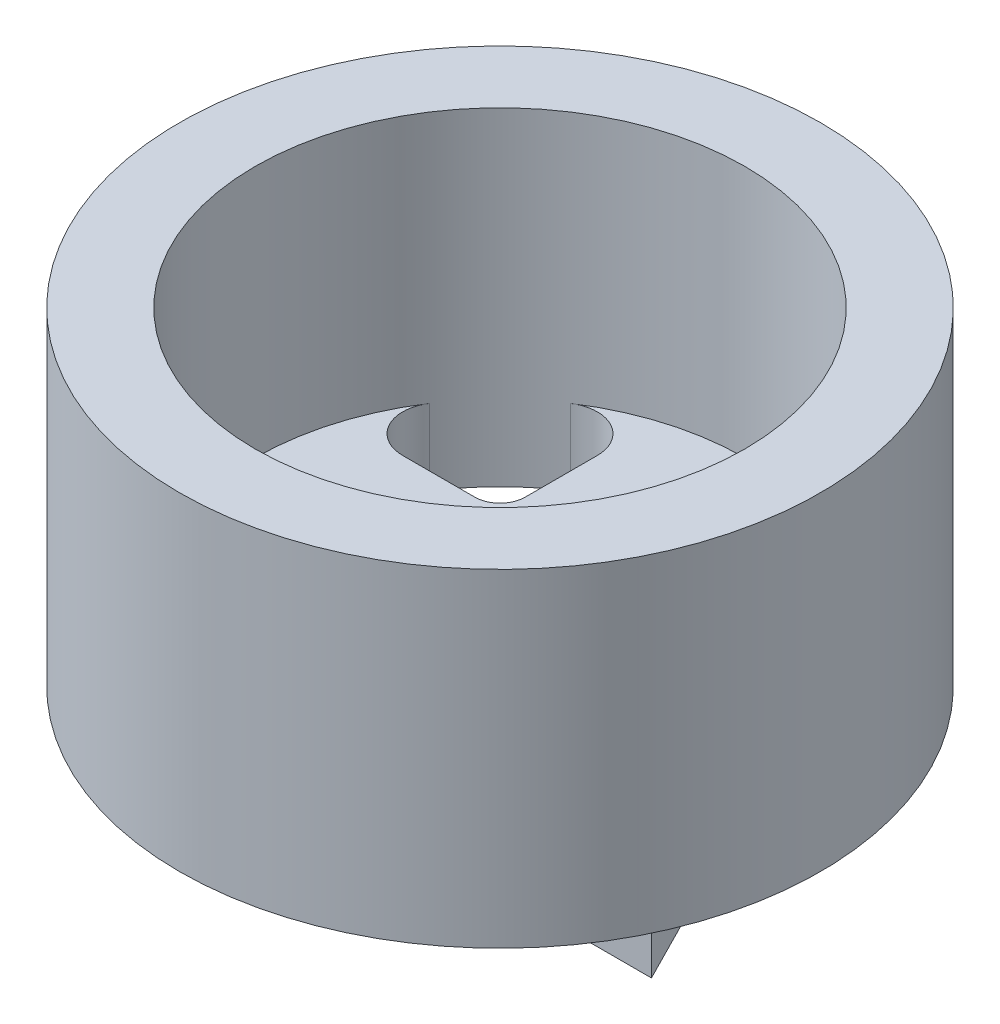
ISO-10303-21;
HEADER;
FILE_DESCRIPTION(('STEP AP214'),'2;1');
FILE_NAME('part.step','',(''),(''),'','','');
FILE_SCHEMA(('AUTOMOTIVE_DESIGN { 1 0 10303 214 1 1 1 1 }'));
ENDSEC;
DATA;
#1=APPLICATION_CONTEXT('core data for automotive mechanical design processes');
#2=APPLICATION_PROTOCOL_DEFINITION('international standard','automotive_design',2000,#1);
#3=PRODUCT_CONTEXT('',#1,'mechanical');
#4=PRODUCT('Part','Part','',(#3));
#5=PRODUCT_RELATED_PRODUCT_CATEGORY('part','',(#4));
#6=PRODUCT_DEFINITION_FORMATION('','',#4);
#7=PRODUCT_DEFINITION_CONTEXT('part definition',#1,'design');
#8=PRODUCT_DEFINITION('design','',#6,#7);
#9=PRODUCT_DEFINITION_SHAPE('','',#8);
#10=(LENGTH_UNIT() NAMED_UNIT(*) SI_UNIT(.MILLI.,.METRE.));
#11=(NAMED_UNIT(*) PLANE_ANGLE_UNIT() SI_UNIT($,.RADIAN.));
#12=(NAMED_UNIT(*) SI_UNIT($,.STERADIAN.) SOLID_ANGLE_UNIT());
#13=UNCERTAINTY_MEASURE_WITH_UNIT(LENGTH_MEASURE(1.E-05),#10,'distance_accuracy_value','');
#14=(GEOMETRIC_REPRESENTATION_CONTEXT(3) GLOBAL_UNCERTAINTY_ASSIGNED_CONTEXT((#13)) GLOBAL_UNIT_ASSIGNED_CONTEXT((#10,
#11,#12)) REPRESENTATION_CONTEXT('',''));
#15=CARTESIAN_POINT('',(0.,0.,0.));
#16=DIRECTION('',(0.,0.,1.));
#17=DIRECTION('',(1.,0.,0.));
#18=AXIS2_PLACEMENT_3D('',#15,#16,#17);
#19=CARTESIAN_POINT('',(-3.,0.,0.));
#20=DIRECTION('',(0.,-1.,0.));
#21=DIRECTION('',(0.,0.,-1.));
#22=AXIS2_PLACEMENT_3D('',#19,#20,#21);
#23=PLANE('',#22);
#24=DIRECTION('',(1.,0.,0.));
#25=VECTOR('',#24,1.);
#26=CARTESIAN_POINT('',(-3.,0.,-3.));
#27=LINE('',#26,#25);
#28=CARTESIAN_POINT('',(-3.,0.,-3.));
#29=VERTEX_POINT('',#28);
#30=CARTESIAN_POINT('',(3.,0.,-3.));
#31=VERTEX_POINT('',#30);
#32=EDGE_CURVE('E52',#29,#31,#27,.T.);
#33=ORIENTED_EDGE('',*,*,#32,.T.);
#34=DIRECTION('',(0.,0.,-1.));
#35=VECTOR('',#34,1.);
#36=CARTESIAN_POINT('',(3.,0.,0.));
#37=LINE('',#36,#35);
#38=CARTESIAN_POINT('',(3.,0.,-12.7));
#39=VERTEX_POINT('',#38);
#40=EDGE_CURVE('E85',#31,#39,#37,.T.);
#41=ORIENTED_EDGE('',*,*,#40,.T.);
#42=DIRECTION('',(1.,0.,0.));
#43=VECTOR('',#42,1.);
#44=CARTESIAN_POINT('',(-3.,0.,-12.7));
#45=LINE('',#44,#43);
#46=CARTESIAN_POINT('',(-3.,0.,-12.7));
#47=VERTEX_POINT('',#46);
#48=EDGE_CURVE('E12',#47,#39,#45,.T.);
#49=ORIENTED_EDGE('',*,*,#48,.F.);
#50=DIRECTION('',(0.,0.,-1.));
#51=VECTOR('',#50,1.);
#52=CARTESIAN_POINT('',(-3.,0.,0.));
#53=LINE('',#52,#51);
#54=EDGE_CURVE('E87',#29,#47,#53,.T.);
#55=ORIENTED_EDGE('',*,*,#54,.F.);
#56=EDGE_LOOP('',(#33,#41,#49,#55));
#57=FACE_BOUND('',#56,.T.);
#58=ADVANCED_FACE('F49',(#57),#23,.F.);
#59=CARTESIAN_POINT('',(-3.,-6.34705548972126,-6.54335617497038));
#60=DIRECTION('',(0.,0.696257929457928,0.717791679853535));
#61=DIRECTION('',(0.,-0.717791679853535,0.696257929457928));
#62=AXIS2_PLACEMENT_3D('',#59,#60,#61);
#63=PLANE('',#62);
#64=ORIENTED_EDGE('',*,*,#48,.T.);
#65=DIRECTION('',(0.,-0.717791679853535,0.696257929457928));
#66=VECTOR('',#65,1.);
#67=CARTESIAN_POINT('',(3.,-6.34705548972126,-6.54335617497038));
#68=LINE('',#67,#66);
#69=CARTESIAN_POINT('',(3.,-10.,-3.));
#70=VERTEX_POINT('',#69);
#71=EDGE_CURVE('E95',#39,#70,#68,.T.);
#72=ORIENTED_EDGE('',*,*,#71,.T.);
#73=DIRECTION('',(1.,0.,0.));
#74=VECTOR('',#73,1.);
#75=CARTESIAN_POINT('',(-3.,-10.,-3.));
#76=LINE('',#75,#74);
#77=CARTESIAN_POINT('',(-3.,-10.,-3.));
#78=VERTEX_POINT('',#77);
#79=EDGE_CURVE('E57',#78,#70,#76,.T.);
#80=ORIENTED_EDGE('',*,*,#79,.F.);
#81=DIRECTION('',(0.,-0.717791679853535,0.696257929457928));
#82=VECTOR('',#81,1.);
#83=CARTESIAN_POINT('',(-3.,-6.34705548972126,-6.54335617497038));
#84=LINE('',#83,#82);
#85=EDGE_CURVE('E64',#47,#78,#84,.T.);
#86=ORIENTED_EDGE('',*,*,#85,.F.);
#87=EDGE_LOOP('',(#64,#72,#80,#86));
#88=FACE_BOUND('',#87,.T.);
#89=ADVANCED_FACE('F105',(#88),#63,.F.);
#90=CARTESIAN_POINT('',(-3.,0.,-3.));
#91=DIRECTION('',(0.,0.,1.));
#92=DIRECTION('',(0.,-1.,0.));
#93=AXIS2_PLACEMENT_3D('',#90,#91,#92);
#94=PLANE('',#93);
#95=ORIENTED_EDGE('',*,*,#79,.T.);
#96=DIRECTION('',(0.,-1.,0.));
#97=VECTOR('',#96,1.);
#98=CARTESIAN_POINT('',(3.,0.,-3.));
#99=LINE('',#98,#97);
#100=EDGE_CURVE('E91',#31,#70,#99,.T.);
#101=ORIENTED_EDGE('',*,*,#100,.F.);
#102=ORIENTED_EDGE('',*,*,#32,.F.);
#103=DIRECTION('',(0.,-1.,0.));
#104=VECTOR('',#103,1.);
#105=CARTESIAN_POINT('',(-3.,0.,-3.));
#106=LINE('',#105,#104);
#107=EDGE_CURVE('E102',#29,#78,#106,.T.);
#108=ORIENTED_EDGE('',*,*,#107,.T.);
#109=EDGE_LOOP('',(#95,#101,#102,#108));
#110=FACE_BOUND('',#109,.T.);
#111=ADVANCED_FACE('F92',(#110),#94,.T.);
#112=CARTESIAN_POINT('',(-3.,0.,0.));
#113=DIRECTION('',(1.,0.,0.));
#114=DIRECTION('',(0.,0.,-1.));
#115=AXIS2_PLACEMENT_3D('',#112,#113,#114);
#116=PLANE('',#115);
#117=ORIENTED_EDGE('',*,*,#54,.T.);
#118=ORIENTED_EDGE('',*,*,#85,.T.);
#119=ORIENTED_EDGE('',*,*,#107,.F.);
#120=EDGE_LOOP('',(#117,#118,#119));
#121=FACE_BOUND('',#120,.T.);
#122=ADVANCED_FACE('F104',(#121),#116,.F.);
#123=CARTESIAN_POINT('',(3.,0.,0.));
#124=DIRECTION('',(1.,0.,0.));
#125=DIRECTION('',(0.,0.,-1.));
#126=AXIS2_PLACEMENT_3D('',#123,#124,#125);
#127=PLANE('',#126);
#128=ORIENTED_EDGE('',*,*,#40,.F.);
#129=ORIENTED_EDGE('',*,*,#100,.T.);
#130=ORIENTED_EDGE('',*,*,#71,.F.);
#131=EDGE_LOOP('',(#128,#129,#130));
#132=FACE_BOUND('',#131,.T.);
#133=ADVANCED_FACE('F97',(#132),#127,.T.);
#134=CLOSED_SHELL('',(#58,#89,#111,#122,#133));
#135=MANIFOLD_SOLID_BREP('B2',#134);
#136=CARTESIAN_POINT('',(0.,13.,0.));
#137=DIRECTION('',(0.,-1.,0.));
#138=DIRECTION('',(0.,0.,-1.));
#139=AXIS2_PLACEMENT_3D('',#136,#137,#138);
#140=CYLINDRICAL_SURFACE('',#139,9.7);
#141=CARTESIAN_POINT('',(0.,3.,0.));
#142=DIRECTION('',(0.,-1.,0.));
#143=DIRECTION('',(0.,0.,-1.));
#144=AXIS2_PLACEMENT_3D('',#141,#142,#143);
#145=CIRCLE('',#144,9.7);
#146=CARTESIAN_POINT('',(-5.32317073170732,3.,-8.10887497505631));
#147=VERTEX_POINT('',#146);
#148=CARTESIAN_POINT('',(5.32317073170732,3.,-8.10887497505631));
#149=VERTEX_POINT('',#148);
#150=EDGE_CURVE('E350',#147,#149,#145,.T.);
#151=ORIENTED_EDGE('',*,*,#150,.T.);
#152=DIRECTION('',(0.,-1.,0.));
#153=VECTOR('',#152,1.);
#154=CARTESIAN_POINT('',(5.32317073170732,13.,-8.10887497505631));
#155=LINE('',#154,#153);
#156=CARTESIAN_POINT('',(5.32317073170732,0.,-8.10887497505631));
#157=VERTEX_POINT('',#156);
#158=EDGE_CURVE('E366',#149,#157,#155,.T.);
#159=ORIENTED_EDGE('',*,*,#158,.T.);
#160=CARTESIAN_POINT('',(0.,0.,0.));
#161=DIRECTION('',(0.,1.,0.));
#162=DIRECTION('',(0.,0.,1.));
#163=AXIS2_PLACEMENT_3D('',#160,#161,#162);
#164=CIRCLE('',#163,9.7);
#165=CARTESIAN_POINT('',(8.10887497505631,0.,-5.32317073170732));
#166=VERTEX_POINT('',#165);
#167=EDGE_CURVE('E511',#166,#157,#164,.T.);
#168=ORIENTED_EDGE('',*,*,#167,.F.);
#169=DIRECTION('',(0.,-1.,0.));
#170=VECTOR('',#169,1.);
#171=CARTESIAN_POINT('',(8.10887497505631,13.,-5.32317073170732));
#172=LINE('',#171,#170);
#173=CARTESIAN_POINT('',(8.10887497505631,3.,-5.32317073170732));
#174=VERTEX_POINT('',#173);
#175=EDGE_CURVE('E360',#166,#174,#172,.F.);
#176=ORIENTED_EDGE('',*,*,#175,.T.);
#177=CARTESIAN_POINT('',(8.10887497505631,3.,5.32317073170732));
#178=VERTEX_POINT('',#177);
#179=EDGE_CURVE('E344',#174,#178,#145,.T.);
#180=ORIENTED_EDGE('',*,*,#179,.T.);
#181=DIRECTION('',(0.,-1.,0.));
#182=VECTOR('',#181,1.);
#183=CARTESIAN_POINT('',(8.10887497505631,13.,5.32317073170732));
#184=LINE('',#183,#182);
#185=CARTESIAN_POINT('',(8.10887497505631,0.,5.32317073170732));
#186=VERTEX_POINT('',#185);
#187=EDGE_CURVE('E357',#178,#186,#184,.T.);
#188=ORIENTED_EDGE('',*,*,#187,.T.);
#189=CARTESIAN_POINT('',(5.32317073170732,0.,8.10887497505631));
#190=VERTEX_POINT('',#189);
#191=EDGE_CURVE('E340',#190,#186,#164,.T.);
#192=ORIENTED_EDGE('',*,*,#191,.F.);
#193=DIRECTION('',(0.,-1.,0.));
#194=VECTOR('',#193,1.);
#195=CARTESIAN_POINT('',(5.32317073170732,13.,8.10887497505631));
#196=LINE('',#195,#194);
#197=CARTESIAN_POINT('',(5.32317073170732,3.,8.10887497505631));
#198=VERTEX_POINT('',#197);
#199=EDGE_CURVE('E354',#190,#198,#196,.F.);
#200=ORIENTED_EDGE('',*,*,#199,.T.);
#201=CARTESIAN_POINT('',(-5.32317073170732,3.,8.10887497505631));
#202=VERTEX_POINT('',#201);
#203=EDGE_CURVE('E348',#198,#202,#145,.T.);
#204=ORIENTED_EDGE('',*,*,#203,.T.);
#205=DIRECTION('',(0.,-1.,0.));
#206=VECTOR('',#205,1.);
#207=CARTESIAN_POINT('',(-5.32317073170732,13.,8.10887497505631));
#208=LINE('',#207,#206);
#209=CARTESIAN_POINT('',(-5.32317073170732,0.,8.10887497505631));
#210=VERTEX_POINT('',#209);
#211=EDGE_CURVE('E336',#202,#210,#208,.T.);
#212=ORIENTED_EDGE('',*,*,#211,.T.);
#213=CARTESIAN_POINT('',(-8.10887497505631,0.,5.32317073170732));
#214=VERTEX_POINT('',#213);
#215=EDGE_CURVE('E320',#214,#210,#164,.T.);
#216=ORIENTED_EDGE('',*,*,#215,.F.);
#217=DIRECTION('',(0.,-1.,0.));
#218=VECTOR('',#217,1.);
#219=CARTESIAN_POINT('',(-8.10887497505631,13.,5.32317073170732));
#220=LINE('',#219,#218);
#221=CARTESIAN_POINT('',(-8.10887497505631,3.,5.32317073170732));
#222=VERTEX_POINT('',#221);
#223=EDGE_CURVE('E333',#214,#222,#220,.F.);
#224=ORIENTED_EDGE('',*,*,#223,.T.);
#225=CARTESIAN_POINT('',(-8.10887497505631,3.,-5.32317073170732));
#226=VERTEX_POINT('',#225);
#227=EDGE_CURVE('E624',#222,#226,#145,.T.);
#228=ORIENTED_EDGE('',*,*,#227,.T.);
#229=DIRECTION('',(0.,-1.,0.));
#230=VECTOR('',#229,1.);
#231=CARTESIAN_POINT('',(-8.10887497505631,13.,-5.32317073170732));
#232=LINE('',#231,#230);
#233=CARTESIAN_POINT('',(-8.10887497505631,0.,-5.32317073170732));
#234=VERTEX_POINT('',#233);
#235=EDGE_CURVE('E343',#226,#234,#232,.T.);
#236=ORIENTED_EDGE('',*,*,#235,.T.);
#237=CARTESIAN_POINT('',(-5.32317073170732,0.,-8.10887497505631));
#238=VERTEX_POINT('',#237);
#239=EDGE_CURVE('E337',#238,#234,#164,.T.);
#240=ORIENTED_EDGE('',*,*,#239,.F.);
#241=DIRECTION('',(0.,-1.,0.));
#242=VECTOR('',#241,1.);
#243=CARTESIAN_POINT('',(-5.32317073170732,13.,-8.10887497505631));
#244=LINE('',#243,#242);
#245=EDGE_CURVE('E363',#238,#147,#244,.F.);
#246=ORIENTED_EDGE('',*,*,#245,.T.);
#247=EDGE_LOOP('',(#151,#159,#168,#176,#180,#188,#192,#200,#204,#212,#216,#224,#228,#236,#240,#246));
#248=FACE_BOUND('',#247,.T.);
#249=CARTESIAN_POINT('',(0.,13.,0.));
#250=DIRECTION('',(0.,1.,0.));
#251=DIRECTION('',(0.,0.,1.));
#252=AXIS2_PLACEMENT_3D('',#249,#250,#251);
#253=CIRCLE('',#252,9.7);
#254=CARTESIAN_POINT('',(0.,13.,9.7));
#255=VERTEX_POINT('',#254);
#256=EDGE_CURVE('E504',#255,#255,#253,.T.);
#257=ORIENTED_EDGE('',*,*,#256,.T.);
#258=EDGE_LOOP('',(#257));
#259=FACE_BOUND('',#258,.T.);
#260=ADVANCED_FACE('F157',(#248,#259),#140,.F.);
#261=CARTESIAN_POINT('',(0.,13.,0.));
#262=DIRECTION('',(0.,-1.,0.));
#263=DIRECTION('',(0.,0.,-1.));
#264=AXIS2_PLACEMENT_3D('',#261,#262,#263);
#265=CYLINDRICAL_SURFACE('',#264,12.7);
#266=CARTESIAN_POINT('',(0.,13.,0.));
#267=DIRECTION('',(0.,1.,0.));
#268=DIRECTION('',(0.,0.,1.));
#269=AXIS2_PLACEMENT_3D('',#266,#267,#268);
#270=CIRCLE('',#269,12.7);
#271=CARTESIAN_POINT('',(0.,13.,-12.7));
#272=VERTEX_POINT('',#271);
#273=EDGE_CURVE('E507',#272,#272,#270,.T.);
#274=CARTESIAN_POINT('',(0.,0.,0.));
#275=DIRECTION('',(0.,1.,0.));
#276=DIRECTION('',(0.,0.,1.));
#277=AXIS2_PLACEMENT_3D('',#274,#275,#276);
#278=CIRCLE('',#277,12.7);
#279=CARTESIAN_POINT('',(0.,0.,-12.7));
#280=VERTEX_POINT('',#279);
#281=EDGE_CURVE('E508',#280,#280,#278,.T.);
#282=CARTESIAN_POINT('',(0.,13.,-12.7));
#283=CARTESIAN_POINT('',(0.,12.8645833333333,-12.7));
#284=CARTESIAN_POINT('',(0.,12.7291666666667,-12.7));
#285=CARTESIAN_POINT('',(0.,12.4583333333333,-12.7));
#286=CARTESIAN_POINT('',(0.,12.3229166666667,-12.7));
#287=CARTESIAN_POINT('',(0.,12.0520833333333,-12.7));
#288=CARTESIAN_POINT('',(0.,11.9166666666667,-12.7));
#289=CARTESIAN_POINT('',(0.,11.6458333333333,-12.7));
#290=CARTESIAN_POINT('',(0.,11.5104166666667,-12.7));
#291=CARTESIAN_POINT('',(0.,11.2395833333333,-12.7));
#292=CARTESIAN_POINT('',(0.,11.1041666666667,-12.7));
#293=CARTESIAN_POINT('',(0.,10.8333333333333,-12.7));
#294=CARTESIAN_POINT('',(0.,10.6979166666667,-12.7));
#295=CARTESIAN_POINT('',(0.,10.4270833333333,-12.7));
#296=CARTESIAN_POINT('',(0.,10.2916666666667,-12.7));
#297=CARTESIAN_POINT('',(0.,10.0208333333333,-12.7));
#298=CARTESIAN_POINT('',(0.,9.88541666666667,-12.7));
#299=CARTESIAN_POINT('',(0.,9.61458333333333,-12.7));
#300=CARTESIAN_POINT('',(0.,9.47916666666667,-12.7));
#301=CARTESIAN_POINT('',(0.,9.20833333333333,-12.7));
#302=CARTESIAN_POINT('',(0.,9.07291666666667,-12.7));
#303=CARTESIAN_POINT('',(0.,8.80208333333333,-12.7));
#304=CARTESIAN_POINT('',(0.,8.66666666666667,-12.7));
#305=CARTESIAN_POINT('',(0.,8.39583333333333,-12.7));
#306=CARTESIAN_POINT('',(0.,8.26041666666667,-12.7));
#307=CARTESIAN_POINT('',(0.,7.98958333333333,-12.7));
#308=CARTESIAN_POINT('',(0.,7.85416666666667,-12.7));
#309=CARTESIAN_POINT('',(0.,7.58333333333333,-12.7));
#310=CARTESIAN_POINT('',(0.,7.44791666666667,-12.7));
#311=CARTESIAN_POINT('',(0.,7.17708333333333,-12.7));
#312=CARTESIAN_POINT('',(0.,7.04166666666667,-12.7));
#313=CARTESIAN_POINT('',(0.,6.77083333333333,-12.7));
#314=CARTESIAN_POINT('',(0.,6.63541666666667,-12.7));
#315=CARTESIAN_POINT('',(0.,6.36458333333333,-12.7));
#316=CARTESIAN_POINT('',(0.,6.22916666666667,-12.7));
#317=CARTESIAN_POINT('',(0.,5.95833333333333,-12.7));
#318=CARTESIAN_POINT('',(0.,5.82291666666667,-12.7));
#319=CARTESIAN_POINT('',(0.,5.55208333333333,-12.7));
#320=CARTESIAN_POINT('',(0.,5.41666666666667,-12.7));
#321=CARTESIAN_POINT('',(0.,5.14583333333333,-12.7));
#322=CARTESIAN_POINT('',(0.,5.01041666666667,-12.7));
#323=CARTESIAN_POINT('',(0.,4.73958333333333,-12.7));
#324=CARTESIAN_POINT('',(0.,4.60416666666667,-12.7));
#325=CARTESIAN_POINT('',(0.,4.33333333333333,-12.7));
#326=CARTESIAN_POINT('',(0.,4.19791666666667,-12.7));
#327=CARTESIAN_POINT('',(0.,3.92708333333333,-12.7));
#328=CARTESIAN_POINT('',(0.,3.79166666666667,-12.7));
#329=CARTESIAN_POINT('',(0.,3.52083333333333,-12.7));
#330=CARTESIAN_POINT('',(0.,3.38541666666667,-12.7));
#331=CARTESIAN_POINT('',(0.,3.11458333333333,-12.7));
#332=CARTESIAN_POINT('',(0.,2.97916666666667,-12.7));
#333=CARTESIAN_POINT('',(0.,2.70833333333333,-12.7));
#334=CARTESIAN_POINT('',(0.,2.57291666666667,-12.7));
#335=CARTESIAN_POINT('',(0.,2.30208333333333,-12.7));
#336=CARTESIAN_POINT('',(0.,2.16666666666667,-12.7));
#337=CARTESIAN_POINT('',(0.,1.89583333333333,-12.7));
#338=CARTESIAN_POINT('',(0.,1.76041666666667,-12.7));
#339=CARTESIAN_POINT('',(0.,1.48958333333333,-12.7));
#340=CARTESIAN_POINT('',(0.,1.35416666666667,-12.7));
#341=CARTESIAN_POINT('',(0.,1.08333333333333,-12.7));
#342=CARTESIAN_POINT('',(0.,0.947916666666667,-12.7));
#343=CARTESIAN_POINT('',(0.,0.677083333333334,-12.7));
#344=CARTESIAN_POINT('',(0.,0.541666666666667,-12.7));
#345=CARTESIAN_POINT('',(0.,0.270833333333334,-12.7));
#346=CARTESIAN_POINT('',(0.,0.135416666666667,-12.7));
#347=CARTESIAN_POINT('',(0.,0.,-12.7));
#348=B_SPLINE_CURVE_WITH_KNOTS('',3,(#282,#283,#284,#285,#286,#287,#288,#289,#290,#291,#292,
#293,#294,#295,#296,#297,#298,#299,#300,#301,#302,#303,#304,#305,#306,#307,#308,#309,#310,#311,
#312,#313,#314,#315,#316,#317,#318,#319,#320,#321,#322,#323,#324,#325,#326,#327,#328,#329,#330,
#331,#332,#333,#334,#335,#336,#337,#338,#339,#340,#341,#342,#343,#344,#345,#346,#347),
.UNSPECIFIED.,.F.,.F.,(4,2,2,2,2,2,2,2,2,2,2,2,2,2,2,2,2,2,2,2,2,2,2,2,2,2,2,2,2,2,2,2,4),(0.,
0.406249999999999,0.812499999999999,1.21875,1.625,2.03125,2.4375,2.84375,3.25,3.65625,4.0625,
4.46875,4.875,5.28125,5.6875,6.09375,6.5,6.90625,7.3125,7.71875,8.125,8.53125,8.9375,9.34375,
9.75,10.15625,10.5625,10.96875,11.375,11.78125,12.1875,12.59375,13.),.UNSPECIFIED.);
#349=EDGE_CURVE('BSEAM515',#272,#280,#348,.T.);
#350=ORIENTED_EDGE('',*,*,#273,.F.);
#351=ORIENTED_EDGE('',*,*,#281,.T.);
#352=ORIENTED_EDGE('',*,*,#349,.T.);
#353=ORIENTED_EDGE('',*,*,#349,.F.);
#354=EDGE_LOOP('',(#350,#352,#351,#353));
#355=FACE_BOUND('',#354,.T.);
#356=ADVANCED_FACE('F515',(#355),#265,.T.);
#357=CARTESIAN_POINT('',(0.,13.,0.));
#358=DIRECTION('',(0.,1.,0.));
#359=DIRECTION('',(0.,0.,1.));
#360=AXIS2_PLACEMENT_3D('',#357,#358,#359);
#361=PLANE('',#360);
#362=ORIENTED_EDGE('',*,*,#256,.F.);
#363=EDGE_LOOP('',(#362));
#364=FACE_BOUND('',#363,.T.);
#365=ORIENTED_EDGE('',*,*,#273,.T.);
#366=EDGE_LOOP('',(#365));
#367=FACE_BOUND('',#366,.T.);
#368=ADVANCED_FACE('F518',(#364,#367),#361,.T.);
#369=CARTESIAN_POINT('',(0.,0.,0.));
#370=DIRECTION('',(0.,1.,0.));
#371=DIRECTION('',(0.,0.,1.));
#372=AXIS2_PLACEMENT_3D('',#369,#370,#371);
#373=PLANE('',#372);
#374=DIRECTION('',(-1.,0.,0.));
#375=VECTOR('',#374,1.);
#376=CARTESIAN_POINT('',(0.,0.,-3.));
#377=LINE('',#376,#375);
#378=CARTESIAN_POINT('',(6.85492523664554,0.,-3.));
#379=VERTEX_POINT('',#378);
#380=CARTESIAN_POINT('',(4.,0.,-3.));
#381=VERTEX_POINT('',#380);
#382=EDGE_CURVE('E484',#379,#381,#377,.T.);
#383=ORIENTED_EDGE('',*,*,#382,.F.);
#384=CARTESIAN_POINT('',(6.85492523664554,0.,-4.5));
#385=DIRECTION('',(0.,1.,0.));
#386=DIRECTION('',(0.,0.,1.));
#387=AXIS2_PLACEMENT_3D('',#384,#385,#386);
#388=CIRCLE('',#387,1.5);
#389=EDGE_CURVE('E399',#379,#166,#388,.T.);
#390=ORIENTED_EDGE('',*,*,#389,.T.);
#391=ORIENTED_EDGE('',*,*,#167,.T.);
#392=CARTESIAN_POINT('',(4.5,0.,-6.85492523664554));
#393=DIRECTION('',(0.,1.,0.));
#394=DIRECTION('',(0.,0.,1.));
#395=AXIS2_PLACEMENT_3D('',#392,#393,#394);
#396=CIRCLE('',#395,1.5);
#397=CARTESIAN_POINT('',(3.,0.,-6.85492523664554));
#398=VERTEX_POINT('',#397);
#399=EDGE_CURVE('E390',#157,#398,#396,.T.);
#400=ORIENTED_EDGE('',*,*,#399,.T.);
#401=DIRECTION('',(0.,0.,1.));
#402=VECTOR('',#401,1.);
#403=CARTESIAN_POINT('',(3.,0.,0.));
#404=LINE('',#403,#402);
#405=CARTESIAN_POINT('',(3.,0.,-4.));
#406=VERTEX_POINT('',#405);
#407=EDGE_CURVE('E492',#398,#406,#404,.T.);
#408=ORIENTED_EDGE('',*,*,#407,.T.);
#409=CARTESIAN_POINT('',(4.,0.,-4.));
#410=DIRECTION('',(0.,1.,0.));
#411=DIRECTION('',(0.,0.,1.));
#412=AXIS2_PLACEMENT_3D('',#409,#410,#411);
#413=CIRCLE('',#412,1.);
#414=EDGE_CURVE('E447',#406,#381,#413,.T.);
#415=ORIENTED_EDGE('',*,*,#414,.T.);
#416=EDGE_LOOP('',(#383,#390,#391,#400,#408,#415));
#417=FACE_BOUND('',#416,.T.);
#418=DIRECTION('',(-1.,0.,0.));
#419=VECTOR('',#418,1.);
#420=CARTESIAN_POINT('',(0.,0.,3.));
#421=LINE('',#420,#419);
#422=CARTESIAN_POINT('',(6.85492523664554,0.,3.));
#423=VERTEX_POINT('',#422);
#424=CARTESIAN_POINT('',(4.,0.,3.));
#425=VERTEX_POINT('',#424);
#426=EDGE_CURVE('E478',#423,#425,#421,.T.);
#427=ORIENTED_EDGE('',*,*,#426,.T.);
#428=CARTESIAN_POINT('',(4.,0.,4.));
#429=DIRECTION('',(0.,1.,0.));
#430=DIRECTION('',(0.,0.,1.));
#431=AXIS2_PLACEMENT_3D('',#428,#429,#430);
#432=CIRCLE('',#431,1.);
#433=CARTESIAN_POINT('',(3.,0.,4.));
#434=VERTEX_POINT('',#433);
#435=EDGE_CURVE('E451',#425,#434,#432,.T.);
#436=ORIENTED_EDGE('',*,*,#435,.T.);
#437=DIRECTION('',(0.,0.,1.));
#438=VECTOR('',#437,1.);
#439=CARTESIAN_POINT('',(3.,0.,0.));
#440=LINE('',#439,#438);
#441=CARTESIAN_POINT('',(3.,0.,6.85492523664554));
#442=VERTEX_POINT('',#441);
#443=EDGE_CURVE('E476',#434,#442,#440,.T.);
#444=ORIENTED_EDGE('',*,*,#443,.T.);
#445=CARTESIAN_POINT('',(4.5,0.,6.85492523664554));
#446=DIRECTION('',(0.,1.,0.));
#447=DIRECTION('',(0.,0.,1.));
#448=AXIS2_PLACEMENT_3D('',#445,#446,#447);
#449=CIRCLE('',#448,1.5);
#450=EDGE_CURVE('E408',#442,#190,#449,.T.);
#451=ORIENTED_EDGE('',*,*,#450,.T.);
#452=ORIENTED_EDGE('',*,*,#191,.T.);
#453=CARTESIAN_POINT('',(6.85492523664554,0.,4.5));
#454=DIRECTION('',(0.,1.,0.));
#455=DIRECTION('',(0.,0.,1.));
#456=AXIS2_PLACEMENT_3D('',#453,#454,#455);
#457=CIRCLE('',#456,1.5);
#458=EDGE_CURVE('E403',#186,#423,#457,.T.);
#459=ORIENTED_EDGE('',*,*,#458,.T.);
#460=EDGE_LOOP('',(#427,#436,#444,#451,#452,#459));
#461=FACE_BOUND('',#460,.T.);
#462=DIRECTION('',(0.,0.,1.));
#463=VECTOR('',#462,1.);
#464=CARTESIAN_POINT('',(-3.,0.,0.));
#465=LINE('',#464,#463);
#466=CARTESIAN_POINT('',(-3.,0.,4.));
#467=VERTEX_POINT('',#466);
#468=CARTESIAN_POINT('',(-3.,0.,6.85492523664554));
#469=VERTEX_POINT('',#468);
#470=EDGE_CURVE('E495',#467,#469,#465,.T.);
#471=ORIENTED_EDGE('',*,*,#470,.F.);
#472=CARTESIAN_POINT('',(-4.,0.,4.));
#473=DIRECTION('',(0.,1.,0.));
#474=DIRECTION('',(0.,0.,1.));
#475=AXIS2_PLACEMENT_3D('',#472,#473,#474);
#476=CIRCLE('',#475,1.);
#477=CARTESIAN_POINT('',(-4.,0.,3.));
#478=VERTEX_POINT('',#477);
#479=EDGE_CURVE('E165',#467,#478,#476,.T.);
#480=ORIENTED_EDGE('',*,*,#479,.T.);
#481=DIRECTION('',(-1.,0.,0.));
#482=VECTOR('',#481,1.);
#483=CARTESIAN_POINT('',(0.,0.,3.));
#484=LINE('',#483,#482);
#485=CARTESIAN_POINT('',(-6.85492523664554,0.,3.));
#486=VERTEX_POINT('',#485);
#487=EDGE_CURVE('E321',#478,#486,#484,.T.);
#488=ORIENTED_EDGE('',*,*,#487,.T.);
#489=CARTESIAN_POINT('',(-6.85492523664554,0.,4.5));
#490=DIRECTION('',(0.,1.,0.));
#491=DIRECTION('',(0.,0.,1.));
#492=AXIS2_PLACEMENT_3D('',#489,#490,#491);
#493=CIRCLE('',#492,1.5);
#494=EDGE_CURVE('E315',#486,#214,#493,.T.);
#495=ORIENTED_EDGE('',*,*,#494,.T.);
#496=ORIENTED_EDGE('',*,*,#215,.T.);
#497=CARTESIAN_POINT('',(-4.5,0.,6.85492523664554));
#498=DIRECTION('',(0.,1.,0.));
#499=DIRECTION('',(0.,0.,1.));
#500=AXIS2_PLACEMENT_3D('',#497,#498,#499);
#501=CIRCLE('',#500,1.5);
#502=EDGE_CURVE('E413',#210,#469,#501,.T.);
#503=ORIENTED_EDGE('',*,*,#502,.T.);
#504=EDGE_LOOP('',(#471,#480,#488,#495,#496,#503));
#505=FACE_BOUND('',#504,.T.);
#506=ORIENTED_EDGE('',*,*,#281,.F.);
#507=EDGE_LOOP('',(#506));
#508=FACE_BOUND('',#507,.T.);
#509=DIRECTION('',(0.,0.,1.));
#510=VECTOR('',#509,1.);
#511=CARTESIAN_POINT('',(-3.,0.,0.));
#512=LINE('',#511,#510);
#513=CARTESIAN_POINT('',(-3.,0.,-6.85492523664554));
#514=VERTEX_POINT('',#513);
#515=CARTESIAN_POINT('',(-3.,0.,-4.));
#516=VERTEX_POINT('',#515);
#517=EDGE_CURVE('E500',#514,#516,#512,.T.);
#518=ORIENTED_EDGE('',*,*,#517,.F.);
#519=CARTESIAN_POINT('',(-4.5,0.,-6.85492523664554));
#520=DIRECTION('',(0.,1.,0.));
#521=DIRECTION('',(0.,0.,1.));
#522=AXIS2_PLACEMENT_3D('',#519,#520,#521);
#523=CIRCLE('',#522,1.5);
#524=EDGE_CURVE('E395',#514,#238,#523,.T.);
#525=ORIENTED_EDGE('',*,*,#524,.T.);
#526=ORIENTED_EDGE('',*,*,#239,.T.);
#527=CARTESIAN_POINT('',(-6.85492523664554,0.,-4.5));
#528=DIRECTION('',(0.,1.,0.));
#529=DIRECTION('',(0.,0.,1.));
#530=AXIS2_PLACEMENT_3D('',#527,#528,#529);
#531=CIRCLE('',#530,1.5);
#532=CARTESIAN_POINT('',(-6.85492523664554,0.,-3.));
#533=VERTEX_POINT('',#532);
#534=EDGE_CURVE('E418',#234,#533,#531,.T.);
#535=ORIENTED_EDGE('',*,*,#534,.T.);
#536=DIRECTION('',(-1.,0.,0.));
#537=VECTOR('',#536,1.);
#538=CARTESIAN_POINT('',(0.,0.,-3.));
#539=LINE('',#538,#537);
#540=CARTESIAN_POINT('',(-4.,0.,-3.));
#541=VERTEX_POINT('',#540);
#542=EDGE_CURVE('E498',#541,#533,#539,.T.);
#543=ORIENTED_EDGE('',*,*,#542,.F.);
#544=CARTESIAN_POINT('',(-4.,0.,-4.));
#545=DIRECTION('',(0.,1.,0.));
#546=DIRECTION('',(0.,0.,1.));
#547=AXIS2_PLACEMENT_3D('',#544,#545,#546);
#548=CIRCLE('',#547,1.);
#549=EDGE_CURVE('E443',#541,#516,#548,.T.);
#550=ORIENTED_EDGE('',*,*,#549,.T.);
#551=EDGE_LOOP('',(#518,#525,#526,#535,#543,#550));
#552=FACE_BOUND('',#551,.T.);
#553=CARTESIAN_POINT('',(0.,0.,0.));
#554=DIRECTION('',(0.,-1.,0.));
#555=DIRECTION('',(0.,0.,-1.));
#556=AXIS2_PLACEMENT_3D('',#553,#554,#555);
#557=CIRCLE('',#556,3.);
#558=CARTESIAN_POINT('',(0.,0.,-3.));
#559=VERTEX_POINT('',#558);
#560=EDGE_CURVE('E482',#559,#559,#557,.T.);
#561=ORIENTED_EDGE('',*,*,#560,.F.);
#562=EDGE_LOOP('',(#561));
#563=FACE_BOUND('',#562,.T.);
#564=ADVANCED_FACE('F317',(#417,#461,#505,#508,#552,#563),#373,.F.);
#565=CARTESIAN_POINT('',(0.,3.,0.));
#566=DIRECTION('',(0.,-1.,0.));
#567=DIRECTION('',(0.,0.,-1.));
#568=AXIS2_PLACEMENT_3D('',#565,#566,#567);
#569=PLANE('',#568);
#570=CARTESIAN_POINT('',(0.,3.,0.));
#571=DIRECTION('',(0.,-1.,0.));
#572=DIRECTION('',(0.,0.,-1.));
#573=AXIS2_PLACEMENT_3D('',#570,#571,#572);
#574=CIRCLE('',#573,3.);
#575=CARTESIAN_POINT('',(0.,3.,-3.));
#576=VERTEX_POINT('',#575);
#577=EDGE_CURVE('E503',#576,#576,#574,.T.);
#578=ORIENTED_EDGE('',*,*,#577,.T.);
#579=EDGE_LOOP('',(#578));
#580=FACE_BOUND('',#579,.T.);
#581=ORIENTED_EDGE('',*,*,#179,.F.);
#582=CARTESIAN_POINT('',(6.85492523664554,3.,-4.5));
#583=DIRECTION('',(0.,-1.,0.));
#584=DIRECTION('',(0.,0.,-1.));
#585=AXIS2_PLACEMENT_3D('',#582,#583,#584);
#586=CIRCLE('',#585,1.5);
#587=CARTESIAN_POINT('',(6.85492523664554,3.,-3.));
#588=VERTEX_POINT('',#587);
#589=EDGE_CURVE('E401',#174,#588,#586,.T.);
#590=ORIENTED_EDGE('',*,*,#589,.T.);
#591=DIRECTION('',(-1.,0.,0.));
#592=VECTOR('',#591,1.);
#593=CARTESIAN_POINT('',(0.,3.,-3.));
#594=LINE('',#593,#592);
#595=CARTESIAN_POINT('',(4.,3.,-3.));
#596=VERTEX_POINT('',#595);
#597=EDGE_CURVE('E471',#588,#596,#594,.T.);
#598=ORIENTED_EDGE('',*,*,#597,.T.);
#599=CARTESIAN_POINT('',(4.,3.,-4.));
#600=DIRECTION('',(0.,-1.,0.));
#601=DIRECTION('',(0.,0.,-1.));
#602=AXIS2_PLACEMENT_3D('',#599,#600,#601);
#603=CIRCLE('',#602,1.);
#604=CARTESIAN_POINT('',(3.,3.,-4.));
#605=VERTEX_POINT('',#604);
#606=EDGE_CURVE('E449',#596,#605,#603,.T.);
#607=ORIENTED_EDGE('',*,*,#606,.T.);
#608=DIRECTION('',(0.,0.,1.));
#609=VECTOR('',#608,1.);
#610=CARTESIAN_POINT('',(3.,3.,0.));
#611=LINE('',#610,#609);
#612=CARTESIAN_POINT('',(3.,3.,-6.85492523664554));
#613=VERTEX_POINT('',#612);
#614=EDGE_CURVE('E601',#613,#605,#611,.T.);
#615=ORIENTED_EDGE('',*,*,#614,.F.);
#616=CARTESIAN_POINT('',(4.5,3.,-6.85492523664554));
#617=DIRECTION('',(0.,-1.,0.));
#618=DIRECTION('',(0.,0.,-1.));
#619=AXIS2_PLACEMENT_3D('',#616,#617,#618);
#620=CIRCLE('',#619,1.5);
#621=EDGE_CURVE('E392',#613,#149,#620,.T.);
#622=ORIENTED_EDGE('',*,*,#621,.T.);
#623=ORIENTED_EDGE('',*,*,#150,.F.);
#624=CARTESIAN_POINT('',(-4.5,3.,-6.85492523664554));
#625=DIRECTION('',(0.,-1.,0.));
#626=DIRECTION('',(0.,0.,-1.));
#627=AXIS2_PLACEMENT_3D('',#624,#625,#626);
#628=CIRCLE('',#627,1.5);
#629=CARTESIAN_POINT('',(-3.,3.,-6.85492523664554));
#630=VERTEX_POINT('',#629);
#631=EDGE_CURVE('E397',#147,#630,#628,.T.);
#632=ORIENTED_EDGE('',*,*,#631,.T.);
#633=DIRECTION('',(0.,0.,1.));
#634=VECTOR('',#633,1.);
#635=CARTESIAN_POINT('',(-3.,3.,0.));
#636=LINE('',#635,#634);
#637=CARTESIAN_POINT('',(-3.,3.,-4.));
#638=VERTEX_POINT('',#637);
#639=EDGE_CURVE('E338',#630,#638,#636,.T.);
#640=ORIENTED_EDGE('',*,*,#639,.T.);
#641=CARTESIAN_POINT('',(-4.,3.,-4.));
#642=DIRECTION('',(0.,-1.,0.));
#643=DIRECTION('',(0.,0.,-1.));
#644=AXIS2_PLACEMENT_3D('',#641,#642,#643);
#645=CIRCLE('',#644,1.);
#646=CARTESIAN_POINT('',(-4.,3.,-3.));
#647=VERTEX_POINT('',#646);
#648=EDGE_CURVE('E445',#638,#647,#645,.T.);
#649=ORIENTED_EDGE('',*,*,#648,.T.);
#650=DIRECTION('',(-1.,0.,0.));
#651=VECTOR('',#650,1.);
#652=CARTESIAN_POINT('',(0.,3.,-3.));
#653=LINE('',#652,#651);
#654=CARTESIAN_POINT('',(-6.85492523664554,3.,-3.));
#655=VERTEX_POINT('',#654);
#656=EDGE_CURVE('E603',#647,#655,#653,.T.);
#657=ORIENTED_EDGE('',*,*,#656,.T.);
#658=CARTESIAN_POINT('',(-6.85492523664554,3.,-4.5));
#659=DIRECTION('',(0.,-1.,0.));
#660=DIRECTION('',(0.,0.,-1.));
#661=AXIS2_PLACEMENT_3D('',#658,#659,#660);
#662=CIRCLE('',#661,1.5);
#663=EDGE_CURVE('E327',#655,#226,#662,.T.);
#664=ORIENTED_EDGE('',*,*,#663,.T.);
#665=ORIENTED_EDGE('',*,*,#227,.F.);
#666=CARTESIAN_POINT('',(-6.85492523664554,3.,4.5));
#667=DIRECTION('',(0.,-1.,0.));
#668=DIRECTION('',(0.,0.,-1.));
#669=AXIS2_PLACEMENT_3D('',#666,#667,#668);
#670=CIRCLE('',#669,1.5);
#671=CARTESIAN_POINT('',(-6.85492523664554,3.,3.));
#672=VERTEX_POINT('',#671);
#673=EDGE_CURVE('E326',#222,#672,#670,.T.);
#674=ORIENTED_EDGE('',*,*,#673,.T.);
#675=DIRECTION('',(-1.,0.,0.));
#676=VECTOR('',#675,1.);
#677=CARTESIAN_POINT('',(0.,3.,3.));
#678=LINE('',#677,#676);
#679=CARTESIAN_POINT('',(-4.,3.,3.));
#680=VERTEX_POINT('',#679);
#681=EDGE_CURVE('E598',#680,#672,#678,.T.);
#682=ORIENTED_EDGE('',*,*,#681,.F.);
#683=CARTESIAN_POINT('',(-4.,3.,4.));
#684=DIRECTION('',(0.,-1.,0.));
#685=DIRECTION('',(0.,0.,-1.));
#686=AXIS2_PLACEMENT_3D('',#683,#684,#685);
#687=CIRCLE('',#686,1.);
#688=CARTESIAN_POINT('',(-3.,3.,4.));
#689=VERTEX_POINT('',#688);
#690=EDGE_CURVE('E47',#680,#689,#687,.T.);
#691=ORIENTED_EDGE('',*,*,#690,.T.);
#692=DIRECTION('',(0.,0.,1.));
#693=VECTOR('',#692,1.);
#694=CARTESIAN_POINT('',(-3.,3.,0.));
#695=LINE('',#694,#693);
#696=CARTESIAN_POINT('',(-3.,3.,6.85492523664554));
#697=VERTEX_POINT('',#696);
#698=EDGE_CURVE('E597',#689,#697,#695,.T.);
#699=ORIENTED_EDGE('',*,*,#698,.T.);
#700=CARTESIAN_POINT('',(-4.5,3.,6.85492523664554));
#701=DIRECTION('',(0.,-1.,0.));
#702=DIRECTION('',(0.,0.,-1.));
#703=AXIS2_PLACEMENT_3D('',#700,#701,#702);
#704=CIRCLE('',#703,1.5);
#705=EDGE_CURVE('E415',#697,#202,#704,.T.);
#706=ORIENTED_EDGE('',*,*,#705,.T.);
#707=ORIENTED_EDGE('',*,*,#203,.F.);
#708=CARTESIAN_POINT('',(4.5,3.,6.85492523664554));
#709=DIRECTION('',(0.,-1.,0.));
#710=DIRECTION('',(0.,0.,-1.));
#711=AXIS2_PLACEMENT_3D('',#708,#709,#710);
#712=CIRCLE('',#711,1.5);
#713=CARTESIAN_POINT('',(3.,3.,6.85492523664554));
#714=VERTEX_POINT('',#713);
#715=EDGE_CURVE('E410',#198,#714,#712,.T.);
#716=ORIENTED_EDGE('',*,*,#715,.T.);
#717=DIRECTION('',(0.,0.,1.));
#718=VECTOR('',#717,1.);
#719=CARTESIAN_POINT('',(3.,3.,0.));
#720=LINE('',#719,#718);
#721=CARTESIAN_POINT('',(3.,3.,4.));
#722=VERTEX_POINT('',#721);
#723=EDGE_CURVE('E462',#722,#714,#720,.T.);
#724=ORIENTED_EDGE('',*,*,#723,.F.);
#725=CARTESIAN_POINT('',(4.,3.,4.));
#726=DIRECTION('',(0.,-1.,0.));
#727=DIRECTION('',(0.,0.,-1.));
#728=AXIS2_PLACEMENT_3D('',#725,#726,#727);
#729=CIRCLE('',#728,1.);
#730=CARTESIAN_POINT('',(4.,3.,3.));
#731=VERTEX_POINT('',#730);
#732=EDGE_CURVE('E453',#722,#731,#729,.T.);
#733=ORIENTED_EDGE('',*,*,#732,.T.);
#734=DIRECTION('',(-1.,0.,0.));
#735=VECTOR('',#734,1.);
#736=CARTESIAN_POINT('',(0.,3.,3.));
#737=LINE('',#736,#735);
#738=CARTESIAN_POINT('',(6.85492523664554,3.,3.));
#739=VERTEX_POINT('',#738);
#740=EDGE_CURVE('E460',#739,#731,#737,.T.);
#741=ORIENTED_EDGE('',*,*,#740,.F.);
#742=CARTESIAN_POINT('',(6.85492523664554,3.,4.5));
#743=DIRECTION('',(0.,-1.,0.));
#744=DIRECTION('',(0.,0.,-1.));
#745=AXIS2_PLACEMENT_3D('',#742,#743,#744);
#746=CIRCLE('',#745,1.5);
#747=EDGE_CURVE('E405',#739,#178,#746,.T.);
#748=ORIENTED_EDGE('',*,*,#747,.T.);
#749=EDGE_LOOP('',(#581,#590,#598,#607,#615,#622,#623,#632,#640,#649,#657,#664,#665,#674,#682,
#691,#699,#706,#707,#716,#724,#733,#741,#748));
#750=FACE_BOUND('',#749,.T.);
#751=ADVANCED_FACE('F459',(#580,#750),#569,.F.);
#752=CARTESIAN_POINT('',(-3.,3.,0.));
#753=DIRECTION('',(1.,0.,0.));
#754=DIRECTION('',(0.,0.,-1.));
#755=AXIS2_PLACEMENT_3D('',#752,#753,#754);
#756=PLANE('',#755);
#757=ORIENTED_EDGE('',*,*,#517,.T.);
#758=DIRECTION('',(0.,-1.,0.));
#759=VECTOR('',#758,1.);
#760=CARTESIAN_POINT('',(-3.,3.,-4.));
#761=LINE('',#760,#759);
#762=EDGE_CURVE('E427',#516,#638,#761,.F.);
#763=ORIENTED_EDGE('',*,*,#762,.T.);
#764=ORIENTED_EDGE('',*,*,#639,.F.);
#765=DIRECTION('',(0.,-1.,0.));
#766=VECTOR('',#765,1.);
#767=CARTESIAN_POINT('',(-3.,3.,-6.85492523664554));
#768=LINE('',#767,#766);
#769=EDGE_CURVE('E371',#630,#514,#768,.T.);
#770=ORIENTED_EDGE('',*,*,#769,.T.);
#771=EDGE_LOOP('',(#757,#763,#764,#770));
#772=FACE_BOUND('',#771,.T.);
#773=ADVANCED_FACE('F655',(#772),#756,.F.);
#774=CARTESIAN_POINT('',(0.,3.,3.));
#775=DIRECTION('',(0.,0.,1.));
#776=DIRECTION('',(1.,0.,0.));
#777=AXIS2_PLACEMENT_3D('',#774,#775,#776);
#778=PLANE('',#777);
#779=ORIENTED_EDGE('',*,*,#487,.F.);
#780=DIRECTION('',(0.,-1.,0.));
#781=VECTOR('',#780,1.);
#782=CARTESIAN_POINT('',(-4.,3.,3.));
#783=LINE('',#782,#781);
#784=EDGE_CURVE('E178',#478,#680,#783,.F.);
#785=ORIENTED_EDGE('',*,*,#784,.T.);
#786=ORIENTED_EDGE('',*,*,#681,.T.);
#787=DIRECTION('',(0.,1.,0.));
#788=VECTOR('',#787,1.);
#789=CARTESIAN_POINT('',(-6.85492523664554,0.,3.));
#790=LINE('',#789,#788);
#791=EDGE_CURVE('E388',#672,#486,#790,.F.);
#792=ORIENTED_EDGE('',*,*,#791,.T.);
#793=EDGE_LOOP('',(#779,#785,#786,#792));
#794=FACE_BOUND('',#793,.T.);
#795=ADVANCED_FACE('F660',(#794),#778,.T.);
#796=CARTESIAN_POINT('',(0.,3.,-3.));
#797=DIRECTION('',(0.,0.,1.));
#798=DIRECTION('',(1.,0.,0.));
#799=AXIS2_PLACEMENT_3D('',#796,#797,#798);
#800=PLANE('',#799);
#801=ORIENTED_EDGE('',*,*,#382,.T.);
#802=DIRECTION('',(0.,-1.,0.));
#803=VECTOR('',#802,1.);
#804=CARTESIAN_POINT('',(4.,3.,-3.));
#805=LINE('',#804,#803);
#806=EDGE_CURVE('E432',#381,#596,#805,.F.);
#807=ORIENTED_EDGE('',*,*,#806,.T.);
#808=ORIENTED_EDGE('',*,*,#597,.F.);
#809=DIRECTION('',(0.,-1.,0.));
#810=VECTOR('',#809,1.);
#811=CARTESIAN_POINT('',(6.85492523664554,3.,-3.));
#812=LINE('',#811,#810);
#813=EDGE_CURVE('E374',#588,#379,#812,.T.);
#814=ORIENTED_EDGE('',*,*,#813,.T.);
#815=EDGE_LOOP('',(#801,#807,#808,#814));
#816=FACE_BOUND('',#815,.T.);
#817=ADVANCED_FACE('F640',(#816),#800,.F.);
#818=CARTESIAN_POINT('',(3.,3.,0.));
#819=DIRECTION('',(1.,0.,0.));
#820=DIRECTION('',(0.,0.,-1.));
#821=AXIS2_PLACEMENT_3D('',#818,#819,#820);
#822=PLANE('',#821);
#823=ORIENTED_EDGE('',*,*,#614,.T.);
#824=DIRECTION('',(0.,-1.,0.));
#825=VECTOR('',#824,1.);
#826=CARTESIAN_POINT('',(3.,3.,-4.));
#827=LINE('',#826,#825);
#828=EDGE_CURVE('E429',#605,#406,#827,.T.);
#829=ORIENTED_EDGE('',*,*,#828,.T.);
#830=ORIENTED_EDGE('',*,*,#407,.F.);
#831=DIRECTION('',(0.,1.,0.));
#832=VECTOR('',#831,1.);
#833=CARTESIAN_POINT('',(3.,3.,-6.85492523664554));
#834=LINE('',#833,#832);
#835=EDGE_CURVE('E369',#398,#613,#834,.T.);
#836=ORIENTED_EDGE('',*,*,#835,.T.);
#837=EDGE_LOOP('',(#823,#829,#830,#836));
#838=FACE_BOUND('',#837,.T.);
#839=ADVANCED_FACE('F635',(#838),#822,.T.);
#840=CARTESIAN_POINT('',(3.,3.,0.));
#841=DIRECTION('',(1.,0.,0.));
#842=DIRECTION('',(0.,0.,-1.));
#843=AXIS2_PLACEMENT_3D('',#840,#841,#842);
#844=PLANE('',#843);
#845=ORIENTED_EDGE('',*,*,#443,.F.);
#846=DIRECTION('',(0.,-1.,0.));
#847=VECTOR('',#846,1.);
#848=CARTESIAN_POINT('',(3.,3.,4.));
#849=LINE('',#848,#847);
#850=EDGE_CURVE('E437',#434,#722,#849,.F.);
#851=ORIENTED_EDGE('',*,*,#850,.T.);
#852=ORIENTED_EDGE('',*,*,#723,.T.);
#853=DIRECTION('',(0.,1.,0.));
#854=VECTOR('',#853,1.);
#855=CARTESIAN_POINT('',(3.,0.,6.85492523664554));
#856=LINE('',#855,#854);
#857=EDGE_CURVE('E379',#714,#442,#856,.F.);
#858=ORIENTED_EDGE('',*,*,#857,.T.);
#859=EDGE_LOOP('',(#845,#851,#852,#858));
#860=FACE_BOUND('',#859,.T.);
#861=ADVANCED_FACE('F480',(#860),#844,.T.);
#862=CARTESIAN_POINT('',(0.,3.,3.));
#863=DIRECTION('',(0.,0.,1.));
#864=DIRECTION('',(1.,0.,0.));
#865=AXIS2_PLACEMENT_3D('',#862,#863,#864);
#866=PLANE('',#865);
#867=ORIENTED_EDGE('',*,*,#740,.T.);
#868=DIRECTION('',(0.,-1.,0.));
#869=VECTOR('',#868,1.);
#870=CARTESIAN_POINT('',(4.,0.,3.));
#871=LINE('',#870,#869);
#872=EDGE_CURVE('E434',#731,#425,#871,.T.);
#873=ORIENTED_EDGE('',*,*,#872,.T.);
#874=ORIENTED_EDGE('',*,*,#426,.F.);
#875=DIRECTION('',(0.,1.,0.));
#876=VECTOR('',#875,1.);
#877=CARTESIAN_POINT('',(6.85492523664554,3.,3.));
#878=LINE('',#877,#876);
#879=EDGE_CURVE('E377',#423,#739,#878,.T.);
#880=ORIENTED_EDGE('',*,*,#879,.T.);
#881=EDGE_LOOP('',(#867,#873,#874,#880));
#882=FACE_BOUND('',#881,.T.);
#883=ADVANCED_FACE('F467',(#882),#866,.T.);
#884=CARTESIAN_POINT('',(-3.,3.,0.));
#885=DIRECTION('',(1.,0.,0.));
#886=DIRECTION('',(0.,0.,-1.));
#887=AXIS2_PLACEMENT_3D('',#884,#885,#886);
#888=PLANE('',#887);
#889=ORIENTED_EDGE('',*,*,#698,.F.);
#890=DIRECTION('',(0.,-1.,0.));
#891=VECTOR('',#890,1.);
#892=CARTESIAN_POINT('',(-3.,3.,4.));
#893=LINE('',#892,#891);
#894=EDGE_CURVE('E439',#689,#467,#893,.T.);
#895=ORIENTED_EDGE('',*,*,#894,.T.);
#896=ORIENTED_EDGE('',*,*,#470,.T.);
#897=DIRECTION('',(0.,-1.,0.));
#898=VECTOR('',#897,1.);
#899=CARTESIAN_POINT('',(-3.,3.,6.85492523664554));
#900=LINE('',#899,#898);
#901=EDGE_CURVE('E382',#469,#697,#900,.F.);
#902=ORIENTED_EDGE('',*,*,#901,.T.);
#903=EDGE_LOOP('',(#889,#895,#896,#902));
#904=FACE_BOUND('',#903,.T.);
#905=ADVANCED_FACE('F528',(#904),#888,.F.);
#906=CARTESIAN_POINT('',(0.,3.,0.));
#907=DIRECTION('',(0.,-1.,0.));
#908=DIRECTION('',(0.,0.,-1.));
#909=AXIS2_PLACEMENT_3D('',#906,#907,#908);
#910=CYLINDRICAL_SURFACE('',#909,3.);
#911=ORIENTED_EDGE('',*,*,#577,.F.);
#912=EDGE_LOOP('',(#911));
#913=FACE_BOUND('',#912,.T.);
#914=ORIENTED_EDGE('',*,*,#560,.T.);
#915=EDGE_LOOP('',(#914));
#916=FACE_BOUND('',#915,.T.);
#917=ADVANCED_FACE('F525',(#913,#916),#910,.F.);
#918=CARTESIAN_POINT('',(0.,3.,-3.));
#919=DIRECTION('',(0.,0.,1.));
#920=DIRECTION('',(1.,0.,0.));
#921=AXIS2_PLACEMENT_3D('',#918,#919,#920);
#922=PLANE('',#921);
#923=ORIENTED_EDGE('',*,*,#656,.F.);
#924=DIRECTION('',(0.,-1.,0.));
#925=VECTOR('',#924,1.);
#926=CARTESIAN_POINT('',(-4.,0.,-3.));
#927=LINE('',#926,#925);
#928=EDGE_CURVE('E424',#647,#541,#927,.T.);
#929=ORIENTED_EDGE('',*,*,#928,.T.);
#930=ORIENTED_EDGE('',*,*,#542,.T.);
#931=DIRECTION('',(0.,-1.,0.));
#932=VECTOR('',#931,1.);
#933=CARTESIAN_POINT('',(-6.85492523664554,3.,-3.));
#934=LINE('',#933,#932);
#935=EDGE_CURVE('E385',#533,#655,#934,.F.);
#936=ORIENTED_EDGE('',*,*,#935,.T.);
#937=EDGE_LOOP('',(#923,#929,#930,#936));
#938=FACE_BOUND('',#937,.T.);
#939=ADVANCED_FACE('F527',(#938),#922,.F.);
#940=CARTESIAN_POINT('',(4.5,13.,-6.85492523664554));
#941=DIRECTION('',(0.,-1.,0.));
#942=DIRECTION('',(0.,0.,-1.));
#943=AXIS2_PLACEMENT_3D('',#940,#941,#942);
#944=CYLINDRICAL_SURFACE('',#943,1.5);
#945=ORIENTED_EDGE('',*,*,#621,.F.);
#946=ORIENTED_EDGE('',*,*,#835,.F.);
#947=ORIENTED_EDGE('',*,*,#399,.F.);
#948=ORIENTED_EDGE('',*,*,#158,.F.);
#949=EDGE_LOOP('',(#945,#946,#947,#948));
#950=FACE_BOUND('',#949,.T.);
#951=ADVANCED_FACE('F535',(#950),#944,.F.);
#952=CARTESIAN_POINT('',(-4.5,13.,-6.85492523664554));
#953=DIRECTION('',(0.,-1.,0.));
#954=DIRECTION('',(0.,0.,-1.));
#955=AXIS2_PLACEMENT_3D('',#952,#953,#954);
#956=CYLINDRICAL_SURFACE('',#955,1.5);
#957=ORIENTED_EDGE('',*,*,#631,.F.);
#958=ORIENTED_EDGE('',*,*,#245,.F.);
#959=ORIENTED_EDGE('',*,*,#524,.F.);
#960=ORIENTED_EDGE('',*,*,#769,.F.);
#961=EDGE_LOOP('',(#957,#958,#959,#960));
#962=FACE_BOUND('',#961,.T.);
#963=ADVANCED_FACE('F553',(#962),#956,.F.);
#964=CARTESIAN_POINT('',(6.85492523664554,13.,-4.5));
#965=DIRECTION('',(0.,-1.,0.));
#966=DIRECTION('',(0.,0.,-1.));
#967=AXIS2_PLACEMENT_3D('',#964,#965,#966);
#968=CYLINDRICAL_SURFACE('',#967,1.5);
#969=ORIENTED_EDGE('',*,*,#589,.F.);
#970=ORIENTED_EDGE('',*,*,#175,.F.);
#971=ORIENTED_EDGE('',*,*,#389,.F.);
#972=ORIENTED_EDGE('',*,*,#813,.F.);
#973=EDGE_LOOP('',(#969,#970,#971,#972));
#974=FACE_BOUND('',#973,.T.);
#975=ADVANCED_FACE('F557',(#974),#968,.F.);
#976=CARTESIAN_POINT('',(6.85492523664554,13.,4.5));
#977=DIRECTION('',(0.,-1.,0.));
#978=DIRECTION('',(0.,0.,-1.));
#979=AXIS2_PLACEMENT_3D('',#976,#977,#978);
#980=CYLINDRICAL_SURFACE('',#979,1.5);
#981=ORIENTED_EDGE('',*,*,#747,.F.);
#982=ORIENTED_EDGE('',*,*,#879,.F.);
#983=ORIENTED_EDGE('',*,*,#458,.F.);
#984=ORIENTED_EDGE('',*,*,#187,.F.);
#985=EDGE_LOOP('',(#981,#982,#983,#984));
#986=FACE_BOUND('',#985,.T.);
#987=ADVANCED_FACE('F561',(#986),#980,.F.);
#988=CARTESIAN_POINT('',(4.5,13.,6.85492523664554));
#989=DIRECTION('',(0.,-1.,0.));
#990=DIRECTION('',(0.,0.,-1.));
#991=AXIS2_PLACEMENT_3D('',#988,#989,#990);
#992=CYLINDRICAL_SURFACE('',#991,1.5);
#993=ORIENTED_EDGE('',*,*,#715,.F.);
#994=ORIENTED_EDGE('',*,*,#199,.F.);
#995=ORIENTED_EDGE('',*,*,#450,.F.);
#996=ORIENTED_EDGE('',*,*,#857,.F.);
#997=EDGE_LOOP('',(#993,#994,#995,#996));
#998=FACE_BOUND('',#997,.T.);
#999=ADVANCED_FACE('F565',(#998),#992,.F.);
#1000=CARTESIAN_POINT('',(-4.5,13.,6.85492523664554));
#1001=DIRECTION('',(0.,-1.,0.));
#1002=DIRECTION('',(0.,0.,-1.));
#1003=AXIS2_PLACEMENT_3D('',#1000,#1001,#1002);
#1004=CYLINDRICAL_SURFACE('',#1003,1.5);
#1005=ORIENTED_EDGE('',*,*,#705,.F.);
#1006=ORIENTED_EDGE('',*,*,#901,.F.);
#1007=ORIENTED_EDGE('',*,*,#502,.F.);
#1008=ORIENTED_EDGE('',*,*,#211,.F.);
#1009=EDGE_LOOP('',(#1005,#1006,#1007,#1008));
#1010=FACE_BOUND('',#1009,.T.);
#1011=ADVANCED_FACE('F569',(#1010),#1004,.F.);
#1012=CARTESIAN_POINT('',(-6.85492523664554,13.,-4.5));
#1013=DIRECTION('',(0.,-1.,0.));
#1014=DIRECTION('',(0.,0.,-1.));
#1015=AXIS2_PLACEMENT_3D('',#1012,#1013,#1014);
#1016=CYLINDRICAL_SURFACE('',#1015,1.5);
#1017=ORIENTED_EDGE('',*,*,#663,.F.);
#1018=ORIENTED_EDGE('',*,*,#935,.F.);
#1019=ORIENTED_EDGE('',*,*,#534,.F.);
#1020=ORIENTED_EDGE('',*,*,#235,.F.);
#1021=EDGE_LOOP('',(#1017,#1018,#1019,#1020));
#1022=FACE_BOUND('',#1021,.T.);
#1023=ADVANCED_FACE('F573',(#1022),#1016,.F.);
#1024=CARTESIAN_POINT('',(-6.85492523664554,13.,4.5));
#1025=DIRECTION('',(0.,-1.,0.));
#1026=DIRECTION('',(0.,0.,-1.));
#1027=AXIS2_PLACEMENT_3D('',#1024,#1025,#1026);
#1028=CYLINDRICAL_SURFACE('',#1027,1.5);
#1029=ORIENTED_EDGE('',*,*,#673,.F.);
#1030=ORIENTED_EDGE('',*,*,#223,.F.);
#1031=ORIENTED_EDGE('',*,*,#494,.F.);
#1032=ORIENTED_EDGE('',*,*,#791,.F.);
#1033=EDGE_LOOP('',(#1029,#1030,#1031,#1032));
#1034=FACE_BOUND('',#1033,.T.);
#1035=ADVANCED_FACE('F341',(#1034),#1028,.F.);
#1036=CARTESIAN_POINT('',(-4.,3.,-4.));
#1037=DIRECTION('',(0.,1.,0.));
#1038=DIRECTION('',(0.,0.,1.));
#1039=AXIS2_PLACEMENT_3D('',#1036,#1037,#1038);
#1040=CYLINDRICAL_SURFACE('',#1039,1.);
#1041=ORIENTED_EDGE('',*,*,#648,.F.);
#1042=ORIENTED_EDGE('',*,*,#762,.F.);
#1043=ORIENTED_EDGE('',*,*,#549,.F.);
#1044=ORIENTED_EDGE('',*,*,#928,.F.);
#1045=EDGE_LOOP('',(#1041,#1042,#1043,#1044));
#1046=FACE_BOUND('',#1045,.T.);
#1047=ADVANCED_FACE('F580',(#1046),#1040,.F.);
#1048=CARTESIAN_POINT('',(4.,3.,-4.));
#1049=DIRECTION('',(0.,-1.,0.));
#1050=DIRECTION('',(0.,0.,-1.));
#1051=AXIS2_PLACEMENT_3D('',#1048,#1049,#1050);
#1052=CYLINDRICAL_SURFACE('',#1051,1.);
#1053=ORIENTED_EDGE('',*,*,#606,.F.);
#1054=ORIENTED_EDGE('',*,*,#806,.F.);
#1055=ORIENTED_EDGE('',*,*,#414,.F.);
#1056=ORIENTED_EDGE('',*,*,#828,.F.);
#1057=EDGE_LOOP('',(#1053,#1054,#1055,#1056));
#1058=FACE_BOUND('',#1057,.T.);
#1059=ADVANCED_FACE('F583',(#1058),#1052,.F.);
#1060=CARTESIAN_POINT('',(4.,3.,4.));
#1061=DIRECTION('',(0.,1.,0.));
#1062=DIRECTION('',(0.,0.,1.));
#1063=AXIS2_PLACEMENT_3D('',#1060,#1061,#1062);
#1064=CYLINDRICAL_SURFACE('',#1063,1.);
#1065=ORIENTED_EDGE('',*,*,#732,.F.);
#1066=ORIENTED_EDGE('',*,*,#850,.F.);
#1067=ORIENTED_EDGE('',*,*,#435,.F.);
#1068=ORIENTED_EDGE('',*,*,#872,.F.);
#1069=EDGE_LOOP('',(#1065,#1066,#1067,#1068));
#1070=FACE_BOUND('',#1069,.T.);
#1071=ADVANCED_FACE('F473',(#1070),#1064,.F.);
#1072=CARTESIAN_POINT('',(-4.,3.,4.));
#1073=DIRECTION('',(0.,-1.,0.));
#1074=DIRECTION('',(0.,0.,-1.));
#1075=AXIS2_PLACEMENT_3D('',#1072,#1073,#1074);
#1076=CYLINDRICAL_SURFACE('',#1075,1.);
#1077=ORIENTED_EDGE('',*,*,#690,.F.);
#1078=ORIENTED_EDGE('',*,*,#784,.F.);
#1079=ORIENTED_EDGE('',*,*,#479,.F.);
#1080=ORIENTED_EDGE('',*,*,#894,.F.);
#1081=EDGE_LOOP('',(#1077,#1078,#1079,#1080));
#1082=FACE_BOUND('',#1081,.T.);
#1083=ADVANCED_FACE('F159',(#1082),#1076,.F.);
#1084=CLOSED_SHELL('',(#260,#356,#368,#564,#751,#773,#795,#817,#839,#861,#883,#905,#917,#939,
#951,#963,#975,#987,#999,#1011,#1023,#1035,#1047,#1059,#1071,#1083));
#1085=MANIFOLD_SOLID_BREP('B6',#1084);
#1086=ADVANCED_BREP_SHAPE_REPRESENTATION('',(#18,#135,#1085),#14);
#1087=SHAPE_DEFINITION_REPRESENTATION(#9,#1086);
ENDSEC;
END-ISO-10303-21;
